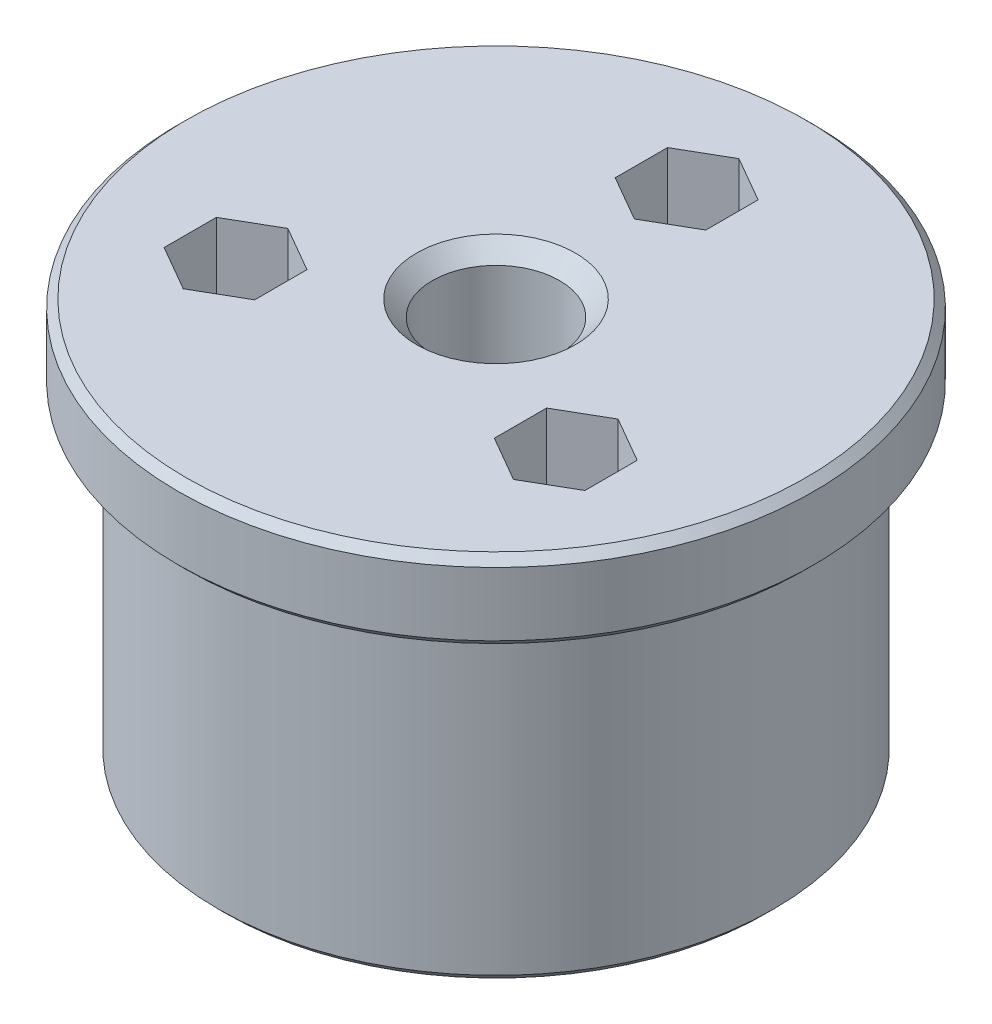
ISO-10303-21;
HEADER;
FILE_DESCRIPTION(('STEP AP214'),'2;1');
FILE_NAME('part.step','',(''),(''),'','','');
FILE_SCHEMA(('AUTOMOTIVE_DESIGN { 1 0 10303 214 1 1 1 1 }'));
ENDSEC;
DATA;
#1=APPLICATION_CONTEXT('core data for automotive mechanical design processes');
#2=APPLICATION_PROTOCOL_DEFINITION('international standard','automotive_design',2000,#1);
#3=PRODUCT_CONTEXT('',#1,'mechanical');
#4=PRODUCT('Part','Part','',(#3));
#5=PRODUCT_RELATED_PRODUCT_CATEGORY('part','',(#4));
#6=PRODUCT_DEFINITION_FORMATION('','',#4);
#7=PRODUCT_DEFINITION_CONTEXT('part definition',#1,'design');
#8=PRODUCT_DEFINITION('design','',#6,#7);
#9=PRODUCT_DEFINITION_SHAPE('','',#8);
#10=(LENGTH_UNIT() NAMED_UNIT(*) SI_UNIT(.MILLI.,.METRE.));
#11=(NAMED_UNIT(*) PLANE_ANGLE_UNIT() SI_UNIT($,.RADIAN.));
#12=(NAMED_UNIT(*) SI_UNIT($,.STERADIAN.) SOLID_ANGLE_UNIT());
#13=UNCERTAINTY_MEASURE_WITH_UNIT(LENGTH_MEASURE(1.E-05),#10,'distance_accuracy_value','');
#14=(GEOMETRIC_REPRESENTATION_CONTEXT(3) GLOBAL_UNCERTAINTY_ASSIGNED_CONTEXT((#13)) GLOBAL_UNIT_ASSIGNED_CONTEXT((#10,
#11,#12)) REPRESENTATION_CONTEXT('',''));
#15=CARTESIAN_POINT('',(0.,0.,0.));
#16=DIRECTION('',(0.,0.,1.));
#17=DIRECTION('',(1.,0.,0.));
#18=AXIS2_PLACEMENT_3D('',#15,#16,#17);
#19=CARTESIAN_POINT('',(0.,25.,0.));
#20=DIRECTION('',(0.,1.,0.));
#21=DIRECTION('',(0.,0.,1.));
#22=AXIS2_PLACEMENT_3D('',#19,#20,#21);
#23=PLANE('',#22);
#24=CARTESIAN_POINT('',(0.,25.,0.));
#25=DIRECTION('',(0.,1.,0.));
#26=DIRECTION('',(0.,0.,1.));
#27=AXIS2_PLACEMENT_3D('',#24,#25,#26);
#28=CIRCLE('',#27,5.00000000000001);
#29=CARTESIAN_POINT('',(0.,25.,5.00000000000001));
#30=VERTEX_POINT('',#29);
#31=EDGE_CURVE('E347',#30,#30,#28,.F.);
#32=ORIENTED_EDGE('',*,*,#31,.T.);
#33=EDGE_LOOP('',(#32));
#34=FACE_BOUND('',#33,.T.);
#35=CARTESIAN_POINT('',(0.,25.,0.));
#36=DIRECTION('',(0.,1.,0.));
#37=DIRECTION('',(0.,0.,1.));
#38=AXIS2_PLACEMENT_3D('',#35,#36,#37);
#39=CIRCLE('',#38,19.5);
#40=CARTESIAN_POINT('',(0.,25.,19.5));
#41=VERTEX_POINT('',#40);
#42=EDGE_CURVE('E317',#41,#41,#39,.T.);
#43=ORIENTED_EDGE('',*,*,#42,.T.);
#44=EDGE_LOOP('',(#43));
#45=FACE_BOUND('',#44,.T.);
#46=DIRECTION('',(0.866025403784434,0.,-0.500000000000008));
#47=VECTOR('',#46,1.);
#48=CARTESIAN_POINT('',(6.62115242270674,25.,11.4681724007856));
#49=LINE('',#48,#47);
#50=CARTESIAN_POINT('',(10.3923048454134,25.,9.29089653438077));
#51=VERTEX_POINT('',#50);
#52=CARTESIAN_POINT('',(13.2423048454133,25.,7.64544826719032));
#53=VERTEX_POINT('',#52);
#54=EDGE_CURVE('E221',#51,#53,#49,.T.);
#55=ORIENTED_EDGE('',*,*,#54,.F.);
#56=DIRECTION('',(0.866025403784443,0.,0.499999999999992));
#57=VECTOR('',#56,1.);
#58=CARTESIAN_POINT('',(-1.42499999999998,25.,2.46817240078566));
#59=LINE('',#58,#57);
#60=CARTESIAN_POINT('',(7.54230484541333,25.,7.64544826719036));
#61=VERTEX_POINT('',#60);
#62=EDGE_CURVE('E219',#61,#51,#59,.T.);
#63=ORIENTED_EDGE('',*,*,#62,.F.);
#64=DIRECTION('',(0.,0.,1.));
#65=VECTOR('',#64,1.);
#66=CARTESIAN_POINT('',(7.54230484541327,25.,0.));
#67=LINE('',#66,#65);
#68=CARTESIAN_POINT('',(7.54230484541331,25.,4.3545517328095));
#69=VERTEX_POINT('',#68);
#70=EDGE_CURVE('E230',#69,#61,#67,.T.);
#71=ORIENTED_EDGE('',*,*,#70,.F.);
#72=DIRECTION('',(-0.866025403784434,0.,0.500000000000008));
#73=VECTOR('',#72,1.);
#74=CARTESIAN_POINT('',(3.77115242270669,25.,6.53182759921432));
#75=LINE('',#74,#73);
#76=CARTESIAN_POINT('',(10.3923048454133,25.,2.70910346561904));
#77=VERTEX_POINT('',#76);
#78=EDGE_CURVE('E228',#77,#69,#75,.T.);
#79=ORIENTED_EDGE('',*,*,#78,.F.);
#80=DIRECTION('',(-0.866025403784443,0.,-0.499999999999992));
#81=VECTOR('',#80,1.);
#82=CARTESIAN_POINT('',(1.42499999999998,25.,-2.46817240078566));
#83=LINE('',#82,#81);
#84=CARTESIAN_POINT('',(13.2423048454133,25.,4.35455173280945));
#85=VERTEX_POINT('',#84);
#86=EDGE_CURVE('E226',#85,#77,#83,.T.);
#87=ORIENTED_EDGE('',*,*,#86,.F.);
#88=DIRECTION('',(0.,0.,-1.));
#89=VECTOR('',#88,1.);
#90=CARTESIAN_POINT('',(13.2423048454133,25.,-1.28369537222284E-13));
#91=LINE('',#90,#89);
#92=EDGE_CURVE('E224',#53,#85,#91,.T.);
#93=ORIENTED_EDGE('',*,*,#92,.F.);
#94=EDGE_LOOP('',(#55,#63,#71,#79,#87,#93));
#95=FACE_BOUND('',#94,.T.);
#96=DIRECTION('',(-0.866025403784439,0.,-0.5));
#97=VECTOR('',#96,1.);
#98=CARTESIAN_POINT('',(6.62115242270663,25.,-11.4681724007857));
#99=LINE('',#98,#97);
#100=CARTESIAN_POINT('',(2.85,25.,-13.6454482671904));
#101=VERTEX_POINT('',#100);
#102=CARTESIAN_POINT('',(0.,25.,-15.2908965343809));
#103=VERTEX_POINT('',#102);
#104=EDGE_CURVE('E264',#101,#103,#99,.T.);
#105=ORIENTED_EDGE('',*,*,#104,.F.);
#106=DIRECTION('',(0.,0.,-1.));
#107=VECTOR('',#106,1.);
#108=CARTESIAN_POINT('',(2.85,25.,0.));
#109=LINE('',#108,#107);
#110=CARTESIAN_POINT('',(2.85,25.,-10.3545517328096));
#111=VERTEX_POINT('',#110);
#112=EDGE_CURVE('E262',#111,#101,#109,.T.);
#113=ORIENTED_EDGE('',*,*,#112,.F.);
#114=DIRECTION('',(0.866025403784439,0.,-0.5));
#115=VECTOR('',#114,1.);
#116=CARTESIAN_POINT('',(-3.77115242270663,25.,-6.53182759921435));
#117=LINE('',#116,#115);
#118=CARTESIAN_POINT('',(0.,25.,-8.70910346561913));
#119=VERTEX_POINT('',#118);
#120=EDGE_CURVE('E274',#119,#111,#117,.T.);
#121=ORIENTED_EDGE('',*,*,#120,.F.);
#122=DIRECTION('',(0.866025403784439,0.,0.5));
#123=VECTOR('',#122,1.);
#124=CARTESIAN_POINT('',(3.77115242270663,25.,-6.53182759921435));
#125=LINE('',#124,#123);
#126=CARTESIAN_POINT('',(-2.85,25.,-10.3545517328096));
#127=VERTEX_POINT('',#126);
#128=EDGE_CURVE('E271',#127,#119,#125,.T.);
#129=ORIENTED_EDGE('',*,*,#128,.F.);
#130=DIRECTION('',(0.,0.,1.));
#131=VECTOR('',#130,1.);
#132=CARTESIAN_POINT('',(-2.85,25.,0.));
#133=LINE('',#132,#131);
#134=CARTESIAN_POINT('',(-2.85,25.,-13.6454482671904));
#135=VERTEX_POINT('',#134);
#136=EDGE_CURVE('E269',#135,#127,#133,.T.);
#137=ORIENTED_EDGE('',*,*,#136,.F.);
#138=DIRECTION('',(-0.866025403784438,0.,0.5));
#139=VECTOR('',#138,1.);
#140=CARTESIAN_POINT('',(-6.62115242270664,25.,-11.4681724007856));
#141=LINE('',#140,#139);
#142=EDGE_CURVE('E267',#103,#135,#141,.T.);
#143=ORIENTED_EDGE('',*,*,#142,.F.);
#144=EDGE_LOOP('',(#105,#113,#121,#129,#137,#143));
#145=FACE_BOUND('',#144,.T.);
#146=DIRECTION('',(0.,0.,1.));
#147=VECTOR('',#146,1.);
#148=CARTESIAN_POINT('',(-13.2423048454133,25.,0.));
#149=LINE('',#148,#147);
#150=CARTESIAN_POINT('',(-13.2423048454133,25.,4.35455173280963));
#151=VERTEX_POINT('',#150);
#152=CARTESIAN_POINT('',(-13.2423048454132,25.,7.6454482671905));
#153=VERTEX_POINT('',#152);
#154=EDGE_CURVE('E173',#151,#153,#149,.T.);
#155=ORIENTED_EDGE('',*,*,#154,.F.);
#156=DIRECTION('',(-0.866025403784437,0.,0.500000000000004));
#157=VECTOR('',#156,1.);
#158=CARTESIAN_POINT('',(-1.42500000000001,25.,-2.46817240078564));
#159=LINE('',#158,#157);
#160=CARTESIAN_POINT('',(-10.3923048454133,25.,2.70910346561918));
#161=VERTEX_POINT('',#160);
#162=EDGE_CURVE('E162',#161,#151,#159,.T.);
#163=ORIENTED_EDGE('',*,*,#162,.F.);
#164=DIRECTION('',(-0.866025403784441,0.,-0.499999999999996));
#165=VECTOR('',#164,1.);
#166=CARTESIAN_POINT('',(-3.7711524227066,25.,6.53182759921437));
#167=LINE('',#166,#165);
#168=CARTESIAN_POINT('',(-7.54230484541325,25.,4.3545517328096));
#169=VERTEX_POINT('',#168);
#170=EDGE_CURVE('E194',#169,#161,#167,.T.);
#171=ORIENTED_EDGE('',*,*,#170,.F.);
#172=DIRECTION('',(0.,0.,-1.));
#173=VECTOR('',#172,1.);
#174=CARTESIAN_POINT('',(-7.54230484541327,25.,0.));
#175=LINE('',#174,#173);
#176=CARTESIAN_POINT('',(-7.54230484541323,25.,7.64544826719047));
#177=VERTEX_POINT('',#176);
#178=EDGE_CURVE('E192',#177,#169,#175,.T.);
#179=ORIENTED_EDGE('',*,*,#178,.F.);
#180=DIRECTION('',(0.866025403784436,0.,-0.500000000000004));
#181=VECTOR('',#180,1.);
#182=CARTESIAN_POINT('',(1.42500000000001,25.,2.46817240078564));
#183=LINE('',#182,#181);
#184=CARTESIAN_POINT('',(-10.3923048454132,25.,9.29089653438092));
#185=VERTEX_POINT('',#184);
#186=EDGE_CURVE('E188',#185,#177,#183,.T.);
#187=ORIENTED_EDGE('',*,*,#186,.F.);
#188=DIRECTION('',(0.866025403784441,0.,0.499999999999996));
#189=VECTOR('',#188,1.);
#190=CARTESIAN_POINT('',(-6.62115242270658,25.,11.4681724007857));
#191=LINE('',#190,#189);
#192=EDGE_CURVE('E186',#153,#185,#191,.T.);
#193=ORIENTED_EDGE('',*,*,#192,.F.);
#194=EDGE_LOOP('',(#155,#163,#171,#179,#187,#193));
#195=FACE_BOUND('',#194,.T.);
#196=ADVANCED_FACE('F34',(#34,#45,#95,#145,#195),#23,.T.);
#197=CARTESIAN_POINT('',(10.3923048454133,25.,5.9999999999999));
#198=DIRECTION('',(0.,-1.,0.));
#199=DIRECTION('',(0.,0.,-1.));
#200=AXIS2_PLACEMENT_3D('',#197,#198,#199);
#201=CYLINDRICAL_SURFACE('',#200,1.6);
#202=CARTESIAN_POINT('',(10.3923048454133,6.,5.9999999999999));
#203=DIRECTION('',(0.,-1.,0.));
#204=DIRECTION('',(0.,0.,-1.));
#205=AXIS2_PLACEMENT_3D('',#202,#203,#204);
#206=CIRCLE('',#205,1.6);
#207=CARTESIAN_POINT('',(10.3923048454133,6.,4.3999999999999));
#208=VERTEX_POINT('',#207);
#209=EDGE_CURVE('E181',#208,#208,#206,.F.);
#210=ORIENTED_EDGE('',*,*,#209,.F.);
#211=EDGE_LOOP('',(#210));
#212=FACE_BOUND('',#211,.T.);
#213=CARTESIAN_POINT('',(10.3923048454133,15.,5.9999999999999));
#214=DIRECTION('',(0.,1.,0.));
#215=DIRECTION('',(-0.866025403784443,0.,-0.499999999999992));
#216=AXIS2_PLACEMENT_3D('',#213,#214,#215);
#217=CIRCLE('',#216,1.6);
#218=CARTESIAN_POINT('',(9.00666419935821,15.,5.19999999999992));
#219=VERTEX_POINT('',#218);
#220=EDGE_CURVE('E233',#219,#219,#217,.T.);
#221=ORIENTED_EDGE('',*,*,#220,.T.);
#222=EDGE_LOOP('',(#221));
#223=FACE_BOUND('',#222,.T.);
#224=ADVANCED_FACE('F368',(#212,#223),#201,.F.);
#225=CARTESIAN_POINT('',(-10.3923048454132,25.,6.00000000000005));
#226=DIRECTION('',(0.,-1.,0.));
#227=DIRECTION('',(0.,0.,-1.));
#228=AXIS2_PLACEMENT_3D('',#225,#226,#227);
#229=CYLINDRICAL_SURFACE('',#228,1.6);
#230=CARTESIAN_POINT('',(-10.3923048454132,6.,6.00000000000005));
#231=DIRECTION('',(0.,-1.,0.));
#232=DIRECTION('',(0.,0.,-1.));
#233=AXIS2_PLACEMENT_3D('',#230,#231,#232);
#234=CIRCLE('',#233,1.6);
#235=CARTESIAN_POINT('',(-10.3923048454132,6.,4.40000000000005));
#236=VERTEX_POINT('',#235);
#237=EDGE_CURVE('E281',#236,#236,#234,.F.);
#238=ORIENTED_EDGE('',*,*,#237,.F.);
#239=EDGE_LOOP('',(#238));
#240=FACE_BOUND('',#239,.T.);
#241=CARTESIAN_POINT('',(-10.3923048454132,15.,6.00000000000005));
#242=DIRECTION('',(0.,1.,0.));
#243=DIRECTION('',(0.866025403784436,0.,-0.500000000000004));
#244=AXIS2_PLACEMENT_3D('',#241,#242,#243);
#245=CIRCLE('',#244,1.6);
#246=CARTESIAN_POINT('',(-9.00666419935814,15.,5.20000000000004));
#247=VERTEX_POINT('',#246);
#248=EDGE_CURVE('E196',#247,#247,#245,.T.);
#249=ORIENTED_EDGE('',*,*,#248,.T.);
#250=EDGE_LOOP('',(#249));
#251=FACE_BOUND('',#250,.T.);
#252=ADVANCED_FACE('F376',(#240,#251),#229,.F.);
#253=CARTESIAN_POINT('',(0.,25.,-12.));
#254=DIRECTION('',(0.,-1.,0.));
#255=DIRECTION('',(0.,0.,-1.));
#256=AXIS2_PLACEMENT_3D('',#253,#254,#255);
#257=CYLINDRICAL_SURFACE('',#256,1.6);
#258=CARTESIAN_POINT('',(0.,6.,-12.));
#259=DIRECTION('',(0.,-1.,0.));
#260=DIRECTION('',(0.,0.,-1.));
#261=AXIS2_PLACEMENT_3D('',#258,#259,#260);
#262=CIRCLE('',#261,1.6);
#263=CARTESIAN_POINT('',(0.,6.,-13.6));
#264=VERTEX_POINT('',#263);
#265=EDGE_CURVE('E310',#264,#264,#262,.F.);
#266=ORIENTED_EDGE('',*,*,#265,.F.);
#267=EDGE_LOOP('',(#266));
#268=FACE_BOUND('',#267,.T.);
#269=CARTESIAN_POINT('',(0.,15.,-12.));
#270=DIRECTION('',(0.,1.,0.));
#271=DIRECTION('',(0.,0.,1.));
#272=AXIS2_PLACEMENT_3D('',#269,#270,#271);
#273=CIRCLE('',#272,1.6);
#274=CARTESIAN_POINT('',(0.,15.,-10.4));
#275=VERTEX_POINT('',#274);
#276=EDGE_CURVE('E277',#275,#275,#273,.T.);
#277=ORIENTED_EDGE('',*,*,#276,.T.);
#278=EDGE_LOOP('',(#277));
#279=FACE_BOUND('',#278,.T.);
#280=ADVANCED_FACE('F393',(#268,#279),#257,.F.);
#281=CARTESIAN_POINT('',(0.,25.,0.));
#282=DIRECTION('',(0.,-1.,0.));
#283=DIRECTION('',(0.,0.,-1.));
#284=AXIS2_PLACEMENT_3D('',#281,#282,#283);
#285=CYLINDRICAL_SURFACE('',#284,20.);
#286=CARTESIAN_POINT('',(0.,24.5,0.));
#287=DIRECTION('',(0.,1.,0.));
#288=DIRECTION('',(0.,0.,1.));
#289=AXIS2_PLACEMENT_3D('',#286,#287,#288);
#290=CIRCLE('',#289,20.);
#291=CARTESIAN_POINT('',(0.,24.5,20.));
#292=VERTEX_POINT('',#291);
#293=EDGE_CURVE('E329',#292,#292,#290,.F.);
#294=ORIENTED_EDGE('',*,*,#293,.T.);
#295=EDGE_LOOP('',(#294));
#296=FACE_BOUND('',#295,.T.);
#297=CARTESIAN_POINT('',(0.,20.5,0.));
#298=DIRECTION('',(0.,1.,0.));
#299=DIRECTION('',(0.,0.,1.));
#300=AXIS2_PLACEMENT_3D('',#297,#298,#299);
#301=CIRCLE('',#300,20.);
#302=CARTESIAN_POINT('',(0.,20.5,20.));
#303=VERTEX_POINT('',#302);
#304=EDGE_CURVE('E326',#303,#303,#301,.T.);
#305=ORIENTED_EDGE('',*,*,#304,.T.);
#306=EDGE_LOOP('',(#305));
#307=FACE_BOUND('',#306,.T.);
#308=ADVANCED_FACE('F390',(#296,#307),#285,.T.);
#309=CARTESIAN_POINT('',(0.,20.,0.));
#310=DIRECTION('',(0.,1.,0.));
#311=DIRECTION('',(0.,0.,1.));
#312=AXIS2_PLACEMENT_3D('',#309,#310,#311);
#313=PLANE('',#312);
#314=CARTESIAN_POINT('',(0.,20.,0.));
#315=DIRECTION('',(0.,1.,0.));
#316=DIRECTION('',(0.,0.,1.));
#317=AXIS2_PLACEMENT_3D('',#314,#315,#316);
#318=CIRCLE('',#317,19.5);
#319=CARTESIAN_POINT('',(0.,20.,19.5));
#320=VERTEX_POINT('',#319);
#321=EDGE_CURVE('E332',#320,#320,#318,.F.);
#322=ORIENTED_EDGE('',*,*,#321,.T.);
#323=EDGE_LOOP('',(#322));
#324=FACE_BOUND('',#323,.T.);
#325=CARTESIAN_POINT('',(0.,20.,0.));
#326=DIRECTION('',(0.,1.,0.));
#327=DIRECTION('',(0.,0.,1.));
#328=AXIS2_PLACEMENT_3D('',#325,#326,#327);
#329=CIRCLE('',#328,17.5);
#330=CARTESIAN_POINT('',(0.,20.,17.5));
#331=VERTEX_POINT('',#330);
#332=EDGE_CURVE('E314',#331,#331,#329,.T.);
#333=ORIENTED_EDGE('',*,*,#332,.T.);
#334=EDGE_LOOP('',(#333));
#335=FACE_BOUND('',#334,.T.);
#336=ADVANCED_FACE('F382',(#324,#335),#313,.F.);
#337=CARTESIAN_POINT('',(0.,20.,0.));
#338=DIRECTION('',(0.,-1.,0.));
#339=DIRECTION('',(0.,0.,-1.));
#340=AXIS2_PLACEMENT_3D('',#337,#338,#339);
#341=CYLINDRICAL_SURFACE('',#340,17.5);
#342=CARTESIAN_POINT('',(0.,0.500000000000004,0.));
#343=DIRECTION('',(0.,1.,0.));
#344=DIRECTION('',(0.,0.,1.));
#345=AXIS2_PLACEMENT_3D('',#342,#343,#344);
#346=CIRCLE('',#345,17.5);
#347=CARTESIAN_POINT('',(0.,0.500000000000004,17.5));
#348=VERTEX_POINT('',#347);
#349=EDGE_CURVE('E335',#348,#348,#346,.T.);
#350=ORIENTED_EDGE('',*,*,#349,.T.);
#351=EDGE_LOOP('',(#350));
#352=FACE_BOUND('',#351,.T.);
#353=ORIENTED_EDGE('',*,*,#332,.F.);
#354=EDGE_LOOP('',(#353));
#355=FACE_BOUND('',#354,.T.);
#356=ADVANCED_FACE('F388',(#352,#355),#341,.T.);
#357=CARTESIAN_POINT('',(0.,0.,0.));
#358=DIRECTION('',(0.,1.,0.));
#359=DIRECTION('',(0.,0.,1.));
#360=AXIS2_PLACEMENT_3D('',#357,#358,#359);
#361=PLANE('',#360);
#362=CARTESIAN_POINT('',(0.,0.,0.));
#363=DIRECTION('',(0.,1.,0.));
#364=DIRECTION('',(0.,0.,1.));
#365=AXIS2_PLACEMENT_3D('',#362,#363,#364);
#366=CIRCLE('',#365,17.);
#367=CARTESIAN_POINT('',(0.,0.,17.));
#368=VERTEX_POINT('',#367);
#369=EDGE_CURVE('E338',#368,#368,#366,.F.);
#370=ORIENTED_EDGE('',*,*,#369,.T.);
#371=EDGE_LOOP('',(#370));
#372=FACE_BOUND('',#371,.T.);
#373=CARTESIAN_POINT('',(0.,0.,0.));
#374=DIRECTION('',(0.,-1.,0.));
#375=DIRECTION('',(0.,0.,-1.));
#376=AXIS2_PLACEMENT_3D('',#373,#374,#375);
#377=CIRCLE('',#376,15.1);
#378=CARTESIAN_POINT('',(0.,0.,-15.1));
#379=VERTEX_POINT('',#378);
#380=EDGE_CURVE('E311',#379,#379,#377,.T.);
#381=ORIENTED_EDGE('',*,*,#380,.F.);
#382=EDGE_LOOP('',(#381));
#383=FACE_BOUND('',#382,.T.);
#384=ADVANCED_FACE('F384',(#372,#383),#361,.F.);
#385=CARTESIAN_POINT('',(0.,6.,0.));
#386=DIRECTION('',(0.,-1.,0.));
#387=DIRECTION('',(0.,0.,-1.));
#388=AXIS2_PLACEMENT_3D('',#385,#386,#387);
#389=CYLINDRICAL_SURFACE('',#388,15.1);
#390=CARTESIAN_POINT('',(0.,5.4,0.));
#391=DIRECTION('',(0.,-1.,0.));
#392=DIRECTION('',(0.,0.,-1.));
#393=AXIS2_PLACEMENT_3D('',#390,#391,#392);
#394=CIRCLE('',#393,15.1);
#395=CARTESIAN_POINT('',(0.,5.4,-15.1));
#396=VERTEX_POINT('',#395);
#397=EDGE_CURVE('E12',#396,#396,#394,.F.);
#398=ORIENTED_EDGE('',*,*,#397,.T.);
#399=EDGE_LOOP('',(#398));
#400=FACE_BOUND('',#399,.T.);
#401=ORIENTED_EDGE('',*,*,#380,.T.);
#402=EDGE_LOOP('',(#401));
#403=FACE_BOUND('',#402,.T.);
#404=ADVANCED_FACE('F387',(#400,#403),#389,.F.);
#405=CARTESIAN_POINT('',(0.,6.,0.));
#406=DIRECTION('',(0.,-1.,0.));
#407=DIRECTION('',(0.,0.,-1.));
#408=AXIS2_PLACEMENT_3D('',#405,#406,#407);
#409=PLANE('',#408);
#410=CARTESIAN_POINT('',(0.,6.,0.));
#411=DIRECTION('',(0.,-1.,0.));
#412=DIRECTION('',(0.,0.,-1.));
#413=AXIS2_PLACEMENT_3D('',#410,#411,#412);
#414=CIRCLE('',#413,14.5);
#415=CARTESIAN_POINT('',(0.,6.,-14.5));
#416=VERTEX_POINT('',#415);
#417=EDGE_CURVE('E42',#416,#416,#414,.T.);
#418=ORIENTED_EDGE('',*,*,#417,.T.);
#419=EDGE_LOOP('',(#418));
#420=FACE_BOUND('',#419,.T.);
#421=CARTESIAN_POINT('',(0.,6.,0.));
#422=DIRECTION('',(0.,-1.,0.));
#423=DIRECTION('',(0.,0.,-1.));
#424=AXIS2_PLACEMENT_3D('',#421,#422,#423);
#425=CIRCLE('',#424,4.99999999999999);
#426=CARTESIAN_POINT('',(0.,6.,-4.99999999999999));
#427=VERTEX_POINT('',#426);
#428=EDGE_CURVE('E350',#427,#427,#425,.F.);
#429=ORIENTED_EDGE('',*,*,#428,.T.);
#430=EDGE_LOOP('',(#429));
#431=FACE_BOUND('',#430,.T.);
#432=ORIENTED_EDGE('',*,*,#237,.T.);
#433=EDGE_LOOP('',(#432));
#434=FACE_BOUND('',#433,.T.);
#435=ORIENTED_EDGE('',*,*,#209,.T.);
#436=EDGE_LOOP('',(#435));
#437=FACE_BOUND('',#436,.T.);
#438=ORIENTED_EDGE('',*,*,#265,.T.);
#439=EDGE_LOOP('',(#438));
#440=FACE_BOUND('',#439,.T.);
#441=ADVANCED_FACE('F355',(#420,#431,#434,#437,#440),#409,.T.);
#442=CARTESIAN_POINT('',(0.,25.,0.));
#443=DIRECTION('',(0.,-1.,0.));
#444=DIRECTION('',(0.,0.,-1.));
#445=AXIS2_PLACEMENT_3D('',#442,#443,#444);
#446=CYLINDRICAL_SURFACE('',#445,4.);
#447=CARTESIAN_POINT('',(0.,24.,0.));
#448=DIRECTION('',(0.,1.,0.));
#449=DIRECTION('',(0.,0.,1.));
#450=AXIS2_PLACEMENT_3D('',#447,#448,#449);
#451=CIRCLE('',#450,4.);
#452=CARTESIAN_POINT('',(0.,24.,4.));
#453=VERTEX_POINT('',#452);
#454=EDGE_CURVE('E344',#453,#453,#451,.T.);
#455=ORIENTED_EDGE('',*,*,#454,.T.);
#456=EDGE_LOOP('',(#455));
#457=FACE_BOUND('',#456,.T.);
#458=CARTESIAN_POINT('',(0.,6.99999999999999,0.));
#459=DIRECTION('',(0.,-1.,0.));
#460=DIRECTION('',(0.,0.,-1.));
#461=AXIS2_PLACEMENT_3D('',#458,#459,#460);
#462=CIRCLE('',#461,4.);
#463=CARTESIAN_POINT('',(0.,6.99999999999999,-4.));
#464=VERTEX_POINT('',#463);
#465=EDGE_CURVE('E341',#464,#464,#462,.T.);
#466=ORIENTED_EDGE('',*,*,#465,.T.);
#467=EDGE_LOOP('',(#466));
#468=FACE_BOUND('',#467,.T.);
#469=ADVANCED_FACE('F416',(#457,#468),#446,.F.);
#470=CARTESIAN_POINT('',(2.85,25.,0.));
#471=DIRECTION('',(-1.,0.,0.));
#472=DIRECTION('',(0.,0.,1.));
#473=AXIS2_PLACEMENT_3D('',#470,#471,#472);
#474=PLANE('',#473);
#475=DIRECTION('',(0.,0.,-1.));
#476=VECTOR('',#475,1.);
#477=CARTESIAN_POINT('',(2.85,15.,0.));
#478=LINE('',#477,#476);
#479=CARTESIAN_POINT('',(2.85,15.,-10.3545517328096));
#480=VERTEX_POINT('',#479);
#481=CARTESIAN_POINT('',(2.85,15.,-13.6454482671904));
#482=VERTEX_POINT('',#481);
#483=EDGE_CURVE('E280',#480,#482,#478,.T.);
#484=ORIENTED_EDGE('',*,*,#483,.F.);
#485=DIRECTION('',(0.,-1.,0.));
#486=VECTOR('',#485,1.);
#487=CARTESIAN_POINT('',(2.85,25.,-10.3545517328096));
#488=LINE('',#487,#486);
#489=EDGE_CURVE('E276',#111,#480,#488,.T.);
#490=ORIENTED_EDGE('',*,*,#489,.F.);
#491=ORIENTED_EDGE('',*,*,#112,.T.);
#492=DIRECTION('',(0.,-1.,0.));
#493=VECTOR('',#492,1.);
#494=CARTESIAN_POINT('',(2.85,25.,-13.6454482671904));
#495=LINE('',#494,#493);
#496=EDGE_CURVE('E307',#101,#482,#495,.T.);
#497=ORIENTED_EDGE('',*,*,#496,.T.);
#498=EDGE_LOOP('',(#484,#490,#491,#497));
#499=FACE_BOUND('',#498,.T.);
#500=ADVANCED_FACE('F419',(#499),#474,.T.);
#501=CARTESIAN_POINT('',(6.62115242270663,25.,-11.4681724007857));
#502=DIRECTION('',(-0.5,0.,0.866025403784439));
#503=DIRECTION('',(0.866025403784439,0.,0.5));
#504=AXIS2_PLACEMENT_3D('',#501,#502,#503);
#505=PLANE('',#504);
#506=DIRECTION('',(-0.866025403784439,0.,-0.5));
#507=VECTOR('',#506,1.);
#508=CARTESIAN_POINT('',(6.62115242270663,15.,-11.4681724007857));
#509=LINE('',#508,#507);
#510=CARTESIAN_POINT('',(0.,15.,-15.2908965343809));
#511=VERTEX_POINT('',#510);
#512=EDGE_CURVE('E284',#482,#511,#509,.T.);
#513=ORIENTED_EDGE('',*,*,#512,.F.);
#514=ORIENTED_EDGE('',*,*,#496,.F.);
#515=ORIENTED_EDGE('',*,*,#104,.T.);
#516=DIRECTION('',(0.,-1.,0.));
#517=VECTOR('',#516,1.);
#518=CARTESIAN_POINT('',(0.,25.,-15.2908965343809));
#519=LINE('',#518,#517);
#520=EDGE_CURVE('E304',#103,#511,#519,.T.);
#521=ORIENTED_EDGE('',*,*,#520,.T.);
#522=EDGE_LOOP('',(#513,#514,#515,#521));
#523=FACE_BOUND('',#522,.T.);
#524=ADVANCED_FACE('F451',(#523),#505,.T.);
#525=CARTESIAN_POINT('',(-6.62115242270664,25.,-11.4681724007856));
#526=DIRECTION('',(0.5,0.,0.866025403784438));
#527=DIRECTION('',(0.866025403784438,0.,-0.5));
#528=AXIS2_PLACEMENT_3D('',#525,#526,#527);
#529=PLANE('',#528);
#530=DIRECTION('',(-0.866025403784438,0.,0.5));
#531=VECTOR('',#530,1.);
#532=CARTESIAN_POINT('',(-6.62115242270664,15.,-11.4681724007856));
#533=LINE('',#532,#531);
#534=CARTESIAN_POINT('',(-2.85,15.,-13.6454482671904));
#535=VERTEX_POINT('',#534);
#536=EDGE_CURVE('E286',#511,#535,#533,.T.);
#537=ORIENTED_EDGE('',*,*,#536,.F.);
#538=ORIENTED_EDGE('',*,*,#520,.F.);
#539=ORIENTED_EDGE('',*,*,#142,.T.);
#540=DIRECTION('',(0.,-1.,0.));
#541=VECTOR('',#540,1.);
#542=CARTESIAN_POINT('',(-2.85,25.,-13.6454482671904));
#543=LINE('',#542,#541);
#544=EDGE_CURVE('E301',#135,#535,#543,.T.);
#545=ORIENTED_EDGE('',*,*,#544,.T.);
#546=EDGE_LOOP('',(#537,#538,#539,#545));
#547=FACE_BOUND('',#546,.T.);
#548=ADVANCED_FACE('F461',(#547),#529,.T.);
#549=CARTESIAN_POINT('',(-2.85,25.,0.));
#550=DIRECTION('',(1.,0.,0.));
#551=DIRECTION('',(0.,0.,-1.));
#552=AXIS2_PLACEMENT_3D('',#549,#550,#551);
#553=PLANE('',#552);
#554=DIRECTION('',(0.,0.,1.));
#555=VECTOR('',#554,1.);
#556=CARTESIAN_POINT('',(-2.85,15.,0.));
#557=LINE('',#556,#555);
#558=CARTESIAN_POINT('',(-2.85,15.,-10.3545517328096));
#559=VERTEX_POINT('',#558);
#560=EDGE_CURVE('E288',#535,#559,#557,.T.);
#561=ORIENTED_EDGE('',*,*,#560,.F.);
#562=ORIENTED_EDGE('',*,*,#544,.F.);
#563=ORIENTED_EDGE('',*,*,#136,.T.);
#564=DIRECTION('',(0.,-1.,0.));
#565=VECTOR('',#564,1.);
#566=CARTESIAN_POINT('',(-2.85,25.,-10.3545517328096));
#567=LINE('',#566,#565);
#568=EDGE_CURVE('E298',#127,#559,#567,.T.);
#569=ORIENTED_EDGE('',*,*,#568,.T.);
#570=EDGE_LOOP('',(#561,#562,#563,#569));
#571=FACE_BOUND('',#570,.T.);
#572=ADVANCED_FACE('F464',(#571),#553,.T.);
#573=CARTESIAN_POINT('',(3.77115242270663,25.,-6.53182759921435));
#574=DIRECTION('',(0.5,0.,-0.866025403784438));
#575=DIRECTION('',(-0.866025403784439,0.,-0.5));
#576=AXIS2_PLACEMENT_3D('',#573,#574,#575);
#577=PLANE('',#576);
#578=DIRECTION('',(0.866025403784439,0.,0.5));
#579=VECTOR('',#578,1.);
#580=CARTESIAN_POINT('',(3.77115242270663,15.,-6.53182759921435));
#581=LINE('',#580,#579);
#582=CARTESIAN_POINT('',(0.,15.,-8.70910346561914));
#583=VERTEX_POINT('',#582);
#584=EDGE_CURVE('E290',#559,#583,#581,.T.);
#585=ORIENTED_EDGE('',*,*,#584,.F.);
#586=ORIENTED_EDGE('',*,*,#568,.F.);
#587=ORIENTED_EDGE('',*,*,#128,.T.);
#588=DIRECTION('',(0.,-1.,0.));
#589=VECTOR('',#588,1.);
#590=CARTESIAN_POINT('',(0.,25.,-8.70910346561914));
#591=LINE('',#590,#589);
#592=EDGE_CURVE('E295',#119,#583,#591,.T.);
#593=ORIENTED_EDGE('',*,*,#592,.T.);
#594=EDGE_LOOP('',(#585,#586,#587,#593));
#595=FACE_BOUND('',#594,.T.);
#596=ADVANCED_FACE('F468',(#595),#577,.T.);
#597=CARTESIAN_POINT('',(-3.77115242270663,25.,-6.53182759921435));
#598=DIRECTION('',(-0.5,0.,-0.866025403784439));
#599=DIRECTION('',(-0.866025403784439,0.,0.5));
#600=AXIS2_PLACEMENT_3D('',#597,#598,#599);
#601=PLANE('',#600);
#602=DIRECTION('',(0.866025403784439,0.,-0.5));
#603=VECTOR('',#602,1.);
#604=CARTESIAN_POINT('',(-3.77115242270663,15.,-6.53182759921435));
#605=LINE('',#604,#603);
#606=EDGE_CURVE('E265',#583,#480,#605,.T.);
#607=ORIENTED_EDGE('',*,*,#606,.F.);
#608=ORIENTED_EDGE('',*,*,#592,.F.);
#609=ORIENTED_EDGE('',*,*,#120,.T.);
#610=ORIENTED_EDGE('',*,*,#489,.T.);
#611=EDGE_LOOP('',(#607,#608,#609,#610));
#612=FACE_BOUND('',#611,.T.);
#613=ADVANCED_FACE('F441',(#612),#601,.T.);
#614=CARTESIAN_POINT('',(0.,15.,0.));
#615=DIRECTION('',(0.,1.,0.));
#616=DIRECTION('',(0.,0.,1.));
#617=AXIS2_PLACEMENT_3D('',#614,#615,#616);
#618=PLANE('',#617);
#619=ORIENTED_EDGE('',*,*,#276,.F.);
#620=EDGE_LOOP('',(#619));
#621=FACE_BOUND('',#620,.T.);
#622=ORIENTED_EDGE('',*,*,#483,.T.);
#623=ORIENTED_EDGE('',*,*,#512,.T.);
#624=ORIENTED_EDGE('',*,*,#536,.T.);
#625=ORIENTED_EDGE('',*,*,#560,.T.);
#626=ORIENTED_EDGE('',*,*,#584,.T.);
#627=ORIENTED_EDGE('',*,*,#606,.T.);
#628=EDGE_LOOP('',(#622,#623,#624,#625,#626,#627));
#629=FACE_BOUND('',#628,.T.);
#630=ADVANCED_FACE('F438',(#621,#629),#618,.T.);
#631=CARTESIAN_POINT('',(-1.42500000000001,25.,-2.46817240078564));
#632=DIRECTION('',(0.500000000000004,0.,0.866025403784437));
#633=DIRECTION('',(0.866025403784437,0.,-0.500000000000004));
#634=AXIS2_PLACEMENT_3D('',#631,#632,#633);
#635=PLANE('',#634);
#636=DIRECTION('',(-0.866025403784437,0.,0.500000000000004));
#637=VECTOR('',#636,1.);
#638=CARTESIAN_POINT('',(-1.42500000000001,15.,-2.46817240078564));
#639=LINE('',#638,#637);
#640=CARTESIAN_POINT('',(-10.3923048454133,15.,2.70910346561918));
#641=VERTEX_POINT('',#640);
#642=CARTESIAN_POINT('',(-13.2423048454133,15.,4.35455173280963));
#643=VERTEX_POINT('',#642);
#644=EDGE_CURVE('E199',#641,#643,#639,.T.);
#645=ORIENTED_EDGE('',*,*,#644,.F.);
#646=DIRECTION('',(0.,-1.,0.));
#647=VECTOR('',#646,1.);
#648=CARTESIAN_POINT('',(-10.3923048454133,25.,2.70910346561918));
#649=LINE('',#648,#647);
#650=EDGE_CURVE('E169',#161,#641,#649,.T.);
#651=ORIENTED_EDGE('',*,*,#650,.F.);
#652=ORIENTED_EDGE('',*,*,#162,.T.);
#653=DIRECTION('',(0.,-1.,0.));
#654=VECTOR('',#653,1.);
#655=CARTESIAN_POINT('',(-13.2423048454133,25.,4.35455173280963));
#656=LINE('',#655,#654);
#657=EDGE_CURVE('E166',#151,#643,#656,.T.);
#658=ORIENTED_EDGE('',*,*,#657,.T.);
#659=EDGE_LOOP('',(#645,#651,#652,#658));
#660=FACE_BOUND('',#659,.T.);
#661=ADVANCED_FACE('F165',(#660),#635,.T.);
#662=CARTESIAN_POINT('',(-13.2423048454133,25.,0.));
#663=DIRECTION('',(1.,0.,0.));
#664=DIRECTION('',(0.,0.,-1.));
#665=AXIS2_PLACEMENT_3D('',#662,#663,#664);
#666=PLANE('',#665);
#667=DIRECTION('',(0.,0.,1.));
#668=VECTOR('',#667,1.);
#669=CARTESIAN_POINT('',(-13.2423048454133,15.,0.));
#670=LINE('',#669,#668);
#671=CARTESIAN_POINT('',(-13.2423048454132,15.,7.6454482671905));
#672=VERTEX_POINT('',#671);
#673=EDGE_CURVE('E180',#643,#672,#670,.T.);
#674=ORIENTED_EDGE('',*,*,#673,.F.);
#675=ORIENTED_EDGE('',*,*,#657,.F.);
#676=ORIENTED_EDGE('',*,*,#154,.T.);
#677=DIRECTION('',(0.,-1.,0.));
#678=VECTOR('',#677,1.);
#679=CARTESIAN_POINT('',(-13.2423048454132,25.,7.6454482671905));
#680=LINE('',#679,#678);
#681=EDGE_CURVE('E182',#153,#672,#680,.T.);
#682=ORIENTED_EDGE('',*,*,#681,.T.);
#683=EDGE_LOOP('',(#674,#675,#676,#682));
#684=FACE_BOUND('',#683,.T.);
#685=ADVANCED_FACE('F177',(#684),#666,.T.);
#686=CARTESIAN_POINT('',(-6.62115242270658,25.,11.4681724007857));
#687=DIRECTION('',(0.499999999999996,0.,-0.866025403784441));
#688=DIRECTION('',(-0.866025403784441,0.,-0.499999999999996));
#689=AXIS2_PLACEMENT_3D('',#686,#687,#688);
#690=PLANE('',#689);
#691=DIRECTION('',(0.866025403784441,0.,0.499999999999996));
#692=VECTOR('',#691,1.);
#693=CARTESIAN_POINT('',(-6.62115242270658,15.,11.4681724007857));
#694=LINE('',#693,#692);
#695=CARTESIAN_POINT('',(-10.3923048454132,15.,9.29089653438092));
#696=VERTEX_POINT('',#695);
#697=EDGE_CURVE('E203',#672,#696,#694,.T.);
#698=ORIENTED_EDGE('',*,*,#697,.F.);
#699=ORIENTED_EDGE('',*,*,#681,.F.);
#700=ORIENTED_EDGE('',*,*,#192,.T.);
#701=DIRECTION('',(0.,-1.,0.));
#702=VECTOR('',#701,1.);
#703=CARTESIAN_POINT('',(-10.3923048454132,25.,9.29089653438092));
#704=LINE('',#703,#702);
#705=EDGE_CURVE('E215',#185,#696,#704,.T.);
#706=ORIENTED_EDGE('',*,*,#705,.T.);
#707=EDGE_LOOP('',(#698,#699,#700,#706));
#708=FACE_BOUND('',#707,.T.);
#709=ADVANCED_FACE('F644',(#708),#690,.T.);
#710=CARTESIAN_POINT('',(1.42500000000001,25.,2.46817240078564));
#711=DIRECTION('',(-0.500000000000004,0.,-0.866025403784436));
#712=DIRECTION('',(-0.866025403784436,0.,0.500000000000004));
#713=AXIS2_PLACEMENT_3D('',#710,#711,#712);
#714=PLANE('',#713);
#715=DIRECTION('',(0.866025403784436,0.,-0.500000000000004));
#716=VECTOR('',#715,1.);
#717=CARTESIAN_POINT('',(1.42500000000001,15.,2.46817240078564));
#718=LINE('',#717,#716);
#719=CARTESIAN_POINT('',(-7.54230484541323,15.,7.64544826719047));
#720=VERTEX_POINT('',#719);
#721=EDGE_CURVE('E205',#696,#720,#718,.T.);
#722=ORIENTED_EDGE('',*,*,#721,.F.);
#723=ORIENTED_EDGE('',*,*,#705,.F.);
#724=ORIENTED_EDGE('',*,*,#186,.T.);
#725=DIRECTION('',(0.,-1.,0.));
#726=VECTOR('',#725,1.);
#727=CARTESIAN_POINT('',(-7.54230484541323,25.,7.64544826719047));
#728=LINE('',#727,#726);
#729=EDGE_CURVE('E212',#177,#720,#728,.T.);
#730=ORIENTED_EDGE('',*,*,#729,.T.);
#731=EDGE_LOOP('',(#722,#723,#724,#730));
#732=FACE_BOUND('',#731,.T.);
#733=ADVANCED_FACE('F634',(#732),#714,.T.);
#734=CARTESIAN_POINT('',(-7.54230484541327,25.,0.));
#735=DIRECTION('',(-1.,0.,0.));
#736=DIRECTION('',(0.,0.,1.));
#737=AXIS2_PLACEMENT_3D('',#734,#735,#736);
#738=PLANE('',#737);
#739=DIRECTION('',(0.,0.,-1.));
#740=VECTOR('',#739,1.);
#741=CARTESIAN_POINT('',(-7.54230484541327,15.,0.));
#742=LINE('',#741,#740);
#743=CARTESIAN_POINT('',(-7.54230484541324,15.,4.3545517328096));
#744=VERTEX_POINT('',#743);
#745=EDGE_CURVE('E207',#720,#744,#742,.T.);
#746=ORIENTED_EDGE('',*,*,#745,.F.);
#747=ORIENTED_EDGE('',*,*,#729,.F.);
#748=ORIENTED_EDGE('',*,*,#178,.T.);
#749=DIRECTION('',(0.,-1.,0.));
#750=VECTOR('',#749,1.);
#751=CARTESIAN_POINT('',(-7.54230484541324,25.,4.3545517328096));
#752=LINE('',#751,#750);
#753=EDGE_CURVE('E49',#169,#744,#752,.T.);
#754=ORIENTED_EDGE('',*,*,#753,.T.);
#755=EDGE_LOOP('',(#746,#747,#748,#754));
#756=FACE_BOUND('',#755,.T.);
#757=ADVANCED_FACE('F625',(#756),#738,.T.);
#758=CARTESIAN_POINT('',(-3.7711524227066,25.,6.53182759921437));
#759=DIRECTION('',(-0.499999999999996,0.,0.866025403784441));
#760=DIRECTION('',(0.866025403784441,0.,0.499999999999996));
#761=AXIS2_PLACEMENT_3D('',#758,#759,#760);
#762=PLANE('',#761);
#763=DIRECTION('',(-0.866025403784441,0.,-0.499999999999996));
#764=VECTOR('',#763,1.);
#765=CARTESIAN_POINT('',(-3.7711524227066,15.,6.53182759921437));
#766=LINE('',#765,#764);
#767=EDGE_CURVE('E174',#744,#641,#766,.T.);
#768=ORIENTED_EDGE('',*,*,#767,.F.);
#769=ORIENTED_EDGE('',*,*,#753,.F.);
#770=ORIENTED_EDGE('',*,*,#170,.T.);
#771=ORIENTED_EDGE('',*,*,#650,.T.);
#772=EDGE_LOOP('',(#768,#769,#770,#771));
#773=FACE_BOUND('',#772,.T.);
#774=ADVANCED_FACE('F615',(#773),#762,.T.);
#775=CARTESIAN_POINT('',(0.,15.,0.));
#776=DIRECTION('',(0.,1.,0.));
#777=DIRECTION('',(0.866025403784436,0.,-0.500000000000004));
#778=AXIS2_PLACEMENT_3D('',#775,#776,#777);
#779=PLANE('',#778);
#780=ORIENTED_EDGE('',*,*,#248,.F.);
#781=EDGE_LOOP('',(#780));
#782=FACE_BOUND('',#781,.T.);
#783=ORIENTED_EDGE('',*,*,#644,.T.);
#784=ORIENTED_EDGE('',*,*,#673,.T.);
#785=ORIENTED_EDGE('',*,*,#697,.T.);
#786=ORIENTED_EDGE('',*,*,#721,.T.);
#787=ORIENTED_EDGE('',*,*,#745,.T.);
#788=ORIENTED_EDGE('',*,*,#767,.T.);
#789=EDGE_LOOP('',(#783,#784,#785,#786,#787,#788));
#790=FACE_BOUND('',#789,.T.);
#791=ADVANCED_FACE('F605',(#782,#790),#779,.T.);
#792=CARTESIAN_POINT('',(-1.42499999999998,25.,2.46817240078566));
#793=DIRECTION('',(0.499999999999992,0.,-0.866025403784443));
#794=DIRECTION('',(-0.866025403784443,0.,-0.499999999999992));
#795=AXIS2_PLACEMENT_3D('',#792,#793,#794);
#796=PLANE('',#795);
#797=DIRECTION('',(0.866025403784443,0.,0.499999999999992));
#798=VECTOR('',#797,1.);
#799=CARTESIAN_POINT('',(-1.42499999999998,15.,2.46817240078566));
#800=LINE('',#799,#798);
#801=CARTESIAN_POINT('',(7.54230484541333,15.,7.64544826719036));
#802=VERTEX_POINT('',#801);
#803=CARTESIAN_POINT('',(10.3923048454134,15.,9.29089653438077));
#804=VERTEX_POINT('',#803);
#805=EDGE_CURVE('E236',#802,#804,#800,.T.);
#806=ORIENTED_EDGE('',*,*,#805,.F.);
#807=DIRECTION('',(0.,-1.,0.));
#808=VECTOR('',#807,1.);
#809=CARTESIAN_POINT('',(7.54230484541333,25.,7.64544826719036));
#810=LINE('',#809,#808);
#811=EDGE_CURVE('E232',#61,#802,#810,.T.);
#812=ORIENTED_EDGE('',*,*,#811,.F.);
#813=ORIENTED_EDGE('',*,*,#62,.T.);
#814=DIRECTION('',(0.,-1.,0.));
#815=VECTOR('',#814,1.);
#816=CARTESIAN_POINT('',(10.3923048454134,25.,9.29089653438077));
#817=LINE('',#816,#815);
#818=EDGE_CURVE('E200',#51,#804,#817,.T.);
#819=ORIENTED_EDGE('',*,*,#818,.T.);
#820=EDGE_LOOP('',(#806,#812,#813,#819));
#821=FACE_BOUND('',#820,.T.);
#822=ADVANCED_FACE('F595',(#821),#796,.T.);
#823=CARTESIAN_POINT('',(6.62115242270674,25.,11.4681724007856));
#824=DIRECTION('',(-0.500000000000008,0.,-0.866025403784434));
#825=DIRECTION('',(-0.866025403784434,0.,0.500000000000008));
#826=AXIS2_PLACEMENT_3D('',#823,#824,#825);
#827=PLANE('',#826);
#828=DIRECTION('',(0.866025403784434,0.,-0.500000000000008));
#829=VECTOR('',#828,1.);
#830=CARTESIAN_POINT('',(6.62115242270674,15.,11.4681724007856));
#831=LINE('',#830,#829);
#832=CARTESIAN_POINT('',(13.2423048454133,15.,7.64544826719032));
#833=VERTEX_POINT('',#832);
#834=EDGE_CURVE('E239',#804,#833,#831,.T.);
#835=ORIENTED_EDGE('',*,*,#834,.F.);
#836=ORIENTED_EDGE('',*,*,#818,.F.);
#837=ORIENTED_EDGE('',*,*,#54,.T.);
#838=DIRECTION('',(0.,-1.,0.));
#839=VECTOR('',#838,1.);
#840=CARTESIAN_POINT('',(13.2423048454133,25.,7.64544826719032));
#841=LINE('',#840,#839);
#842=EDGE_CURVE('E257',#53,#833,#841,.T.);
#843=ORIENTED_EDGE('',*,*,#842,.T.);
#844=EDGE_LOOP('',(#835,#836,#837,#843));
#845=FACE_BOUND('',#844,.T.);
#846=ADVANCED_FACE('F585',(#845),#827,.T.);
#847=CARTESIAN_POINT('',(13.2423048454133,25.,-1.28369537222284E-13));
#848=DIRECTION('',(-1.,0.,0.));
#849=DIRECTION('',(0.,0.,1.));
#850=AXIS2_PLACEMENT_3D('',#847,#848,#849);
#851=PLANE('',#850);
#852=DIRECTION('',(0.,0.,-1.));
#853=VECTOR('',#852,1.);
#854=CARTESIAN_POINT('',(13.2423048454133,15.,-1.28369537222284E-13));
#855=LINE('',#854,#853);
#856=CARTESIAN_POINT('',(13.2423048454133,15.,4.35455173280945));
#857=VERTEX_POINT('',#856);
#858=EDGE_CURVE('E241',#833,#857,#855,.T.);
#859=ORIENTED_EDGE('',*,*,#858,.F.);
#860=ORIENTED_EDGE('',*,*,#842,.F.);
#861=ORIENTED_EDGE('',*,*,#92,.T.);
#862=DIRECTION('',(0.,-1.,0.));
#863=VECTOR('',#862,1.);
#864=CARTESIAN_POINT('',(13.2423048454133,25.,4.35455173280945));
#865=LINE('',#864,#863);
#866=EDGE_CURVE('E254',#85,#857,#865,.T.);
#867=ORIENTED_EDGE('',*,*,#866,.T.);
#868=EDGE_LOOP('',(#859,#860,#861,#867));
#869=FACE_BOUND('',#868,.T.);
#870=ADVANCED_FACE('F575',(#869),#851,.T.);
#871=CARTESIAN_POINT('',(1.42499999999998,25.,-2.46817240078566));
#872=DIRECTION('',(-0.499999999999992,0.,0.866025403784443));
#873=DIRECTION('',(0.866025403784443,0.,0.499999999999992));
#874=AXIS2_PLACEMENT_3D('',#871,#872,#873);
#875=PLANE('',#874);
#876=DIRECTION('',(-0.866025403784443,0.,-0.499999999999992));
#877=VECTOR('',#876,1.);
#878=CARTESIAN_POINT('',(1.42499999999998,15.,-2.46817240078566));
#879=LINE('',#878,#877);
#880=CARTESIAN_POINT('',(10.3923048454133,15.,2.70910346561904));
#881=VERTEX_POINT('',#880);
#882=EDGE_CURVE('E243',#857,#881,#879,.T.);
#883=ORIENTED_EDGE('',*,*,#882,.F.);
#884=ORIENTED_EDGE('',*,*,#866,.F.);
#885=ORIENTED_EDGE('',*,*,#86,.T.);
#886=DIRECTION('',(0.,-1.,0.));
#887=VECTOR('',#886,1.);
#888=CARTESIAN_POINT('',(10.3923048454133,25.,2.70910346561904));
#889=LINE('',#888,#887);
#890=EDGE_CURVE('E251',#77,#881,#889,.T.);
#891=ORIENTED_EDGE('',*,*,#890,.T.);
#892=EDGE_LOOP('',(#883,#884,#885,#891));
#893=FACE_BOUND('',#892,.T.);
#894=ADVANCED_FACE('F565',(#893),#875,.T.);
#895=CARTESIAN_POINT('',(3.77115242270669,25.,6.53182759921432));
#896=DIRECTION('',(0.500000000000008,0.,0.866025403784434));
#897=DIRECTION('',(0.866025403784434,0.,-0.500000000000008));
#898=AXIS2_PLACEMENT_3D('',#895,#896,#897);
#899=PLANE('',#898);
#900=DIRECTION('',(-0.866025403784434,0.,0.500000000000008));
#901=VECTOR('',#900,1.);
#902=CARTESIAN_POINT('',(3.77115242270669,15.,6.53182759921432));
#903=LINE('',#902,#901);
#904=CARTESIAN_POINT('',(7.54230484541331,15.,4.3545517328095));
#905=VERTEX_POINT('',#904);
#906=EDGE_CURVE('E245',#881,#905,#903,.T.);
#907=ORIENTED_EDGE('',*,*,#906,.F.);
#908=ORIENTED_EDGE('',*,*,#890,.F.);
#909=ORIENTED_EDGE('',*,*,#78,.T.);
#910=DIRECTION('',(0.,-1.,0.));
#911=VECTOR('',#910,1.);
#912=CARTESIAN_POINT('',(7.54230484541331,25.,4.3545517328095));
#913=LINE('',#912,#911);
#914=EDGE_CURVE('E57',#69,#905,#913,.T.);
#915=ORIENTED_EDGE('',*,*,#914,.T.);
#916=EDGE_LOOP('',(#907,#908,#909,#915));
#917=FACE_BOUND('',#916,.T.);
#918=ADVANCED_FACE('F556',(#917),#899,.T.);
#919=CARTESIAN_POINT('',(7.54230484541327,25.,0.));
#920=DIRECTION('',(1.,0.,0.));
#921=DIRECTION('',(0.,0.,-1.));
#922=AXIS2_PLACEMENT_3D('',#919,#920,#921);
#923=PLANE('',#922);
#924=DIRECTION('',(0.,0.,1.));
#925=VECTOR('',#924,1.);
#926=CARTESIAN_POINT('',(7.54230484541327,15.,0.));
#927=LINE('',#926,#925);
#928=EDGE_CURVE('E222',#905,#802,#927,.T.);
#929=ORIENTED_EDGE('',*,*,#928,.F.);
#930=ORIENTED_EDGE('',*,*,#914,.F.);
#931=ORIENTED_EDGE('',*,*,#70,.T.);
#932=ORIENTED_EDGE('',*,*,#811,.T.);
#933=EDGE_LOOP('',(#929,#930,#931,#932));
#934=FACE_BOUND('',#933,.T.);
#935=ADVANCED_FACE('F545',(#934),#923,.T.);
#936=CARTESIAN_POINT('',(0.,15.,0.));
#937=DIRECTION('',(0.,1.,0.));
#938=DIRECTION('',(-0.866025403784443,0.,-0.499999999999992));
#939=AXIS2_PLACEMENT_3D('',#936,#937,#938);
#940=PLANE('',#939);
#941=ORIENTED_EDGE('',*,*,#220,.F.);
#942=EDGE_LOOP('',(#941));
#943=FACE_BOUND('',#942,.T.);
#944=ORIENTED_EDGE('',*,*,#805,.T.);
#945=ORIENTED_EDGE('',*,*,#834,.T.);
#946=ORIENTED_EDGE('',*,*,#858,.T.);
#947=ORIENTED_EDGE('',*,*,#882,.T.);
#948=ORIENTED_EDGE('',*,*,#906,.T.);
#949=ORIENTED_EDGE('',*,*,#928,.T.);
#950=EDGE_LOOP('',(#944,#945,#946,#947,#948,#949));
#951=FACE_BOUND('',#950,.T.);
#952=ADVANCED_FACE('F399',(#943,#951),#940,.T.);
#953=CARTESIAN_POINT('',(0.,25.,0.));
#954=DIRECTION('',(0.,-1.,0.));
#955=DIRECTION('',(0.,0.,-1.));
#956=AXIS2_PLACEMENT_3D('',#953,#954,#955);
#957=CONICAL_SURFACE('',#956,19.5,0.785398163397441);
#958=ORIENTED_EDGE('',*,*,#293,.F.);
#959=EDGE_LOOP('',(#958));
#960=FACE_BOUND('',#959,.T.);
#961=ORIENTED_EDGE('',*,*,#42,.F.);
#962=EDGE_LOOP('',(#961));
#963=FACE_BOUND('',#962,.T.);
#964=ADVANCED_FACE('F395',(#960,#963),#957,.T.);
#965=CARTESIAN_POINT('',(0.,20.5,0.));
#966=DIRECTION('',(0.,1.,0.));
#967=DIRECTION('',(0.,0.,1.));
#968=AXIS2_PLACEMENT_3D('',#965,#966,#967);
#969=CONICAL_SURFACE('',#968,20.,0.785398163397459);
#970=ORIENTED_EDGE('',*,*,#321,.F.);
#971=EDGE_LOOP('',(#970));
#972=FACE_BOUND('',#971,.T.);
#973=ORIENTED_EDGE('',*,*,#304,.F.);
#974=EDGE_LOOP('',(#973));
#975=FACE_BOUND('',#974,.T.);
#976=ADVANCED_FACE('F398',(#972,#975),#969,.T.);
#977=CARTESIAN_POINT('',(0.,0.500000000000004,0.));
#978=DIRECTION('',(0.,1.,0.));
#979=DIRECTION('',(0.,0.,1.));
#980=AXIS2_PLACEMENT_3D('',#977,#978,#979);
#981=CONICAL_SURFACE('',#980,17.5,0.785398163397452);
#982=ORIENTED_EDGE('',*,*,#369,.F.);
#983=EDGE_LOOP('',(#982));
#984=FACE_BOUND('',#983,.T.);
#985=ORIENTED_EDGE('',*,*,#349,.F.);
#986=EDGE_LOOP('',(#985));
#987=FACE_BOUND('',#986,.T.);
#988=ADVANCED_FACE('F403',(#984,#987),#981,.T.);
#989=CARTESIAN_POINT('',(0.,24.,0.));
#990=DIRECTION('',(0.,1.,0.));
#991=DIRECTION('',(0.,0.,1.));
#992=AXIS2_PLACEMENT_3D('',#989,#990,#991);
#993=CONICAL_SURFACE('',#992,4.,0.785398163397455);
#994=ORIENTED_EDGE('',*,*,#31,.F.);
#995=EDGE_LOOP('',(#994));
#996=FACE_BOUND('',#995,.T.);
#997=ORIENTED_EDGE('',*,*,#454,.F.);
#998=EDGE_LOOP('',(#997));
#999=FACE_BOUND('',#998,.T.);
#1000=ADVANCED_FACE('F364',(#996,#999),#993,.F.);
#1001=CARTESIAN_POINT('',(0.,6.,0.));
#1002=DIRECTION('',(0.,-1.,0.));
#1003=DIRECTION('',(0.,0.,-1.));
#1004=AXIS2_PLACEMENT_3D('',#1001,#1002,#1003);
#1005=CONICAL_SURFACE('',#1004,4.99999999999999,0.785398163397447);
#1006=ORIENTED_EDGE('',*,*,#465,.F.);
#1007=EDGE_LOOP('',(#1006));
#1008=FACE_BOUND('',#1007,.T.);
#1009=ORIENTED_EDGE('',*,*,#428,.F.);
#1010=EDGE_LOOP('',(#1009));
#1011=FACE_BOUND('',#1010,.T.);
#1012=ADVANCED_FACE('F359',(#1008,#1011),#1005,.F.);
#1013=CARTESIAN_POINT('',(0.,5.4,0.));
#1014=DIRECTION('',(0.,-1.,0.));
#1015=DIRECTION('',(0.,0.,-1.));
#1016=AXIS2_PLACEMENT_3D('',#1013,#1014,#1015);
#1017=TOROIDAL_SURFACE('',#1016,14.5,0.6);
#1018=ORIENTED_EDGE('',*,*,#397,.F.);
#1019=EDGE_LOOP('',(#1018));
#1020=FACE_BOUND('',#1019,.T.);
#1021=ORIENTED_EDGE('',*,*,#417,.F.);
#1022=EDGE_LOOP('',(#1021));
#1023=FACE_BOUND('',#1022,.T.);
#1024=ADVANCED_FACE('F36',(#1020,#1023),#1017,.F.);
#1025=CLOSED_SHELL('',(#196,#224,#252,#280,#308,#336,#356,#384,#404,#441,#469,#500,#524,#548,
#572,#596,#613,#630,#661,#685,#709,#733,#757,#774,#791,#822,#846,#870,#894,#918,#935,#952,#964,
#976,#988,#1000,#1012,#1024));
#1026=MANIFOLD_SOLID_BREP('B2',#1025);
#1027=ADVANCED_BREP_SHAPE_REPRESENTATION('',(#18,#1026),#14);
#1028=SHAPE_DEFINITION_REPRESENTATION(#9,#1027);
ENDSEC;
END-ISO-10303-21;
